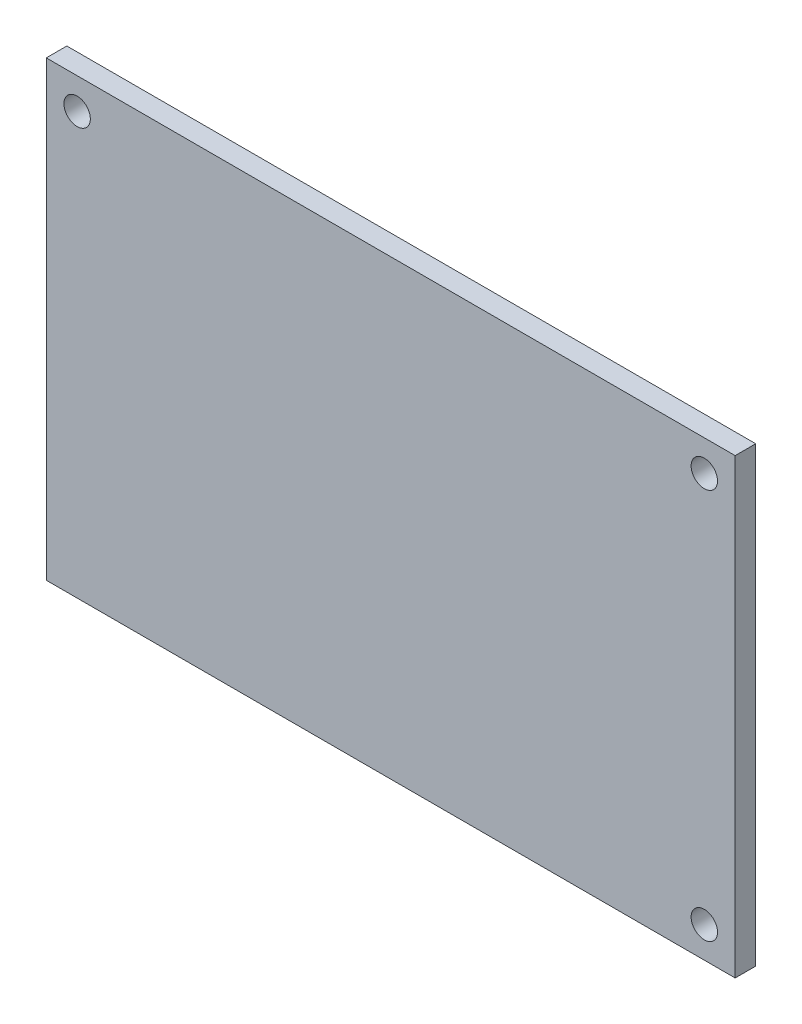
ISO-10303-21;
HEADER;
FILE_DESCRIPTION(('STEP AP214'),'2;1');
FILE_NAME('part.step','',(''),(''),'','','');
FILE_SCHEMA(('AUTOMOTIVE_DESIGN { 1 0 10303 214 1 1 1 1 }'));
ENDSEC;
DATA;
#1=APPLICATION_CONTEXT('core data for automotive mechanical design processes');
#2=APPLICATION_PROTOCOL_DEFINITION('international standard','automotive_design',2000,#1);
#3=PRODUCT_CONTEXT('',#1,'mechanical');
#4=PRODUCT('Part','Part','',(#3));
#5=PRODUCT_RELATED_PRODUCT_CATEGORY('part','',(#4));
#6=PRODUCT_DEFINITION_FORMATION('','',#4);
#7=PRODUCT_DEFINITION_CONTEXT('part definition',#1,'design');
#8=PRODUCT_DEFINITION('design','',#6,#7);
#9=PRODUCT_DEFINITION_SHAPE('','',#8);
#10=(LENGTH_UNIT() NAMED_UNIT(*) SI_UNIT(.MILLI.,.METRE.));
#11=(NAMED_UNIT(*) PLANE_ANGLE_UNIT() SI_UNIT($,.RADIAN.));
#12=(NAMED_UNIT(*) SI_UNIT($,.STERADIAN.) SOLID_ANGLE_UNIT());
#13=UNCERTAINTY_MEASURE_WITH_UNIT(LENGTH_MEASURE(1.E-05),#10,'distance_accuracy_value','');
#14=(GEOMETRIC_REPRESENTATION_CONTEXT(3) GLOBAL_UNCERTAINTY_ASSIGNED_CONTEXT((#13)) GLOBAL_UNIT_ASSIGNED_CONTEXT((#10,
#11,#12)) REPRESENTATION_CONTEXT('',''));
#15=CARTESIAN_POINT('',(0.,0.,0.));
#16=DIRECTION('',(0.,0.,1.));
#17=DIRECTION('',(1.,0.,0.));
#18=AXIS2_PLACEMENT_3D('',#15,#16,#17);
#19=CARTESIAN_POINT('',(42.545,27.94,2.54));
#20=DIRECTION('',(-1.,0.,0.));
#21=DIRECTION('',(0.,0.,1.));
#22=AXIS2_PLACEMENT_3D('',#19,#20,#21);
#23=PLANE('',#22);
#24=DIRECTION('',(0.,1.,0.));
#25=VECTOR('',#24,1.);
#26=CARTESIAN_POINT('',(42.545,27.94,0.));
#27=LINE('',#26,#25);
#28=CARTESIAN_POINT('',(42.545,-27.94,0.));
#29=VERTEX_POINT('',#28);
#30=CARTESIAN_POINT('',(42.545,27.94,0.));
#31=VERTEX_POINT('',#30);
#32=EDGE_CURVE('E96',#29,#31,#27,.T.);
#33=ORIENTED_EDGE('',*,*,#32,.T.);
#34=DIRECTION('',(0.,0.,-1.));
#35=VECTOR('',#34,1.);
#36=CARTESIAN_POINT('',(42.545,27.94,2.54));
#37=LINE('',#36,#35);
#38=CARTESIAN_POINT('',(42.545,27.94,2.54));
#39=VERTEX_POINT('',#38);
#40=EDGE_CURVE('E11',#39,#31,#37,.T.);
#41=ORIENTED_EDGE('',*,*,#40,.F.);
#42=DIRECTION('',(0.,1.,0.));
#43=VECTOR('',#42,1.);
#44=CARTESIAN_POINT('',(42.545,27.94,2.54));
#45=LINE('',#44,#43);
#46=CARTESIAN_POINT('',(42.545,-27.94,2.54));
#47=VERTEX_POINT('',#46);
#48=EDGE_CURVE('E84',#47,#39,#45,.T.);
#49=ORIENTED_EDGE('',*,*,#48,.F.);
#50=DIRECTION('',(0.,0.,-1.));
#51=VECTOR('',#50,1.);
#52=CARTESIAN_POINT('',(42.545,-27.94,2.54));
#53=LINE('',#52,#51);
#54=EDGE_CURVE('E92',#47,#29,#53,.T.);
#55=ORIENTED_EDGE('',*,*,#54,.T.);
#56=EDGE_LOOP('',(#33,#41,#49,#55));
#57=FACE_BOUND('',#56,.T.);
#58=ADVANCED_FACE('F33',(#57),#23,.F.);
#59=CARTESIAN_POINT('',(-42.545,27.94,2.54));
#60=DIRECTION('',(0.,-1.,0.));
#61=DIRECTION('',(0.,0.,-1.));
#62=AXIS2_PLACEMENT_3D('',#59,#60,#61);
#63=PLANE('',#62);
#64=DIRECTION('',(-1.,0.,0.));
#65=VECTOR('',#64,1.);
#66=CARTESIAN_POINT('',(-42.545,27.94,0.));
#67=LINE('',#66,#65);
#68=CARTESIAN_POINT('',(-42.545,27.94,0.));
#69=VERTEX_POINT('',#68);
#70=EDGE_CURVE('E88',#31,#69,#67,.T.);
#71=ORIENTED_EDGE('',*,*,#70,.T.);
#72=DIRECTION('',(0.,0.,-1.));
#73=VECTOR('',#72,1.);
#74=CARTESIAN_POINT('',(-42.545,27.94,2.54));
#75=LINE('',#74,#73);
#76=CARTESIAN_POINT('',(-42.545,27.94,2.54));
#77=VERTEX_POINT('',#76);
#78=EDGE_CURVE('E41',#77,#69,#75,.T.);
#79=ORIENTED_EDGE('',*,*,#78,.F.);
#80=DIRECTION('',(-1.,0.,0.));
#81=VECTOR('',#80,1.);
#82=CARTESIAN_POINT('',(-42.545,27.94,2.54));
#83=LINE('',#82,#81);
#84=EDGE_CURVE('E79',#39,#77,#83,.T.);
#85=ORIENTED_EDGE('',*,*,#84,.F.);
#86=ORIENTED_EDGE('',*,*,#40,.T.);
#87=EDGE_LOOP('',(#71,#79,#85,#86));
#88=FACE_BOUND('',#87,.T.);
#89=ADVANCED_FACE('F87',(#88),#63,.F.);
#90=CARTESIAN_POINT('',(-42.545,27.94,2.54));
#91=DIRECTION('',(1.,0.,0.));
#92=DIRECTION('',(0.,1.,0.));
#93=AXIS2_PLACEMENT_3D('',#90,#91,#92);
#94=PLANE('',#93);
#95=DIRECTION('',(0.,-1.,0.));
#96=VECTOR('',#95,1.);
#97=CARTESIAN_POINT('',(-42.545,27.94,0.));
#98=LINE('',#97,#96);
#99=CARTESIAN_POINT('',(-42.545,-27.94,0.));
#100=VERTEX_POINT('',#99);
#101=EDGE_CURVE('E66',#69,#100,#98,.T.);
#102=ORIENTED_EDGE('',*,*,#101,.T.);
#103=DIRECTION('',(0.,0.,-1.));
#104=VECTOR('',#103,1.);
#105=CARTESIAN_POINT('',(-42.545,-27.94,2.54));
#106=LINE('',#105,#104);
#107=CARTESIAN_POINT('',(-42.545,-27.94,2.54));
#108=VERTEX_POINT('',#107);
#109=EDGE_CURVE('E89',#108,#100,#106,.T.);
#110=ORIENTED_EDGE('',*,*,#109,.F.);
#111=DIRECTION('',(0.,-1.,0.));
#112=VECTOR('',#111,1.);
#113=CARTESIAN_POINT('',(-42.545,27.94,2.54));
#114=LINE('',#113,#112);
#115=EDGE_CURVE('E82',#77,#108,#114,.T.);
#116=ORIENTED_EDGE('',*,*,#115,.F.);
#117=ORIENTED_EDGE('',*,*,#78,.T.);
#118=EDGE_LOOP('',(#102,#110,#116,#117));
#119=FACE_BOUND('',#118,.T.);
#120=ADVANCED_FACE('F90',(#119),#94,.F.);
#121=CARTESIAN_POINT('',(-42.545,-27.94,2.54));
#122=DIRECTION('',(0.,1.,0.));
#123=DIRECTION('',(0.,0.,1.));
#124=AXIS2_PLACEMENT_3D('',#121,#122,#123);
#125=PLANE('',#124);
#126=DIRECTION('',(1.,0.,0.));
#127=VECTOR('',#126,1.);
#128=CARTESIAN_POINT('',(-42.545,-27.94,0.));
#129=LINE('',#128,#127);
#130=EDGE_CURVE('E72',#100,#29,#129,.T.);
#131=ORIENTED_EDGE('',*,*,#130,.T.);
#132=ORIENTED_EDGE('',*,*,#54,.F.);
#133=DIRECTION('',(1.,0.,0.));
#134=VECTOR('',#133,1.);
#135=CARTESIAN_POINT('',(-42.545,-27.94,2.54));
#136=LINE('',#135,#134);
#137=EDGE_CURVE('E49',#108,#47,#136,.T.);
#138=ORIENTED_EDGE('',*,*,#137,.F.);
#139=ORIENTED_EDGE('',*,*,#109,.T.);
#140=EDGE_LOOP('',(#131,#132,#138,#139));
#141=FACE_BOUND('',#140,.T.);
#142=ADVANCED_FACE('F104',(#141),#125,.F.);
#143=CARTESIAN_POINT('',(0.,0.,2.54));
#144=DIRECTION('',(0.,0.,1.));
#145=DIRECTION('',(1.,0.,0.));
#146=AXIS2_PLACEMENT_3D('',#143,#144,#145);
#147=PLANE('',#146);
#148=CARTESIAN_POINT('',(-38.735,24.13,2.54));
#149=DIRECTION('',(0.,0.,1.));
#150=DIRECTION('',(1.,0.,0.));
#151=AXIS2_PLACEMENT_3D('',#148,#149,#150);
#152=CIRCLE('',#151,1.63195);
#153=CARTESIAN_POINT('',(-37.10305,24.13,2.54));
#154=VERTEX_POINT('',#153);
#155=EDGE_CURVE('E124',#154,#154,#152,.T.);
#156=ORIENTED_EDGE('',*,*,#155,.F.);
#157=EDGE_LOOP('',(#156));
#158=FACE_BOUND('',#157,.T.);
#159=CARTESIAN_POINT('',(38.735,-24.13,2.54));
#160=DIRECTION('',(0.,0.,1.));
#161=DIRECTION('',(1.,0.,0.));
#162=AXIS2_PLACEMENT_3D('',#159,#160,#161);
#163=CIRCLE('',#162,1.63195);
#164=CARTESIAN_POINT('',(40.36695,-24.13,2.54));
#165=VERTEX_POINT('',#164);
#166=EDGE_CURVE('E118',#165,#165,#163,.T.);
#167=ORIENTED_EDGE('',*,*,#166,.F.);
#168=EDGE_LOOP('',(#167));
#169=FACE_BOUND('',#168,.T.);
#170=CARTESIAN_POINT('',(38.735,24.13,2.54));
#171=DIRECTION('',(0.,0.,1.));
#172=DIRECTION('',(1.,0.,0.));
#173=AXIS2_PLACEMENT_3D('',#170,#171,#172);
#174=CIRCLE('',#173,1.63195);
#175=CARTESIAN_POINT('',(40.36695,24.13,2.54));
#176=VERTEX_POINT('',#175);
#177=EDGE_CURVE('E112',#176,#176,#174,.T.);
#178=ORIENTED_EDGE('',*,*,#177,.F.);
#179=EDGE_LOOP('',(#178));
#180=FACE_BOUND('',#179,.T.);
#181=ORIENTED_EDGE('',*,*,#48,.T.);
#182=ORIENTED_EDGE('',*,*,#84,.T.);
#183=ORIENTED_EDGE('',*,*,#115,.T.);
#184=ORIENTED_EDGE('',*,*,#137,.T.);
#185=EDGE_LOOP('',(#181,#182,#183,#184));
#186=FACE_BOUND('',#185,.T.);
#187=ADVANCED_FACE('F80',(#158,#169,#180,#186),#147,.T.);
#188=CARTESIAN_POINT('',(0.,0.,0.));
#189=DIRECTION('',(0.,0.,1.));
#190=DIRECTION('',(1.,0.,0.));
#191=AXIS2_PLACEMENT_3D('',#188,#189,#190);
#192=PLANE('',#191);
#193=CARTESIAN_POINT('',(-38.735,24.13,0.));
#194=DIRECTION('',(0.,0.,1.));
#195=DIRECTION('',(1.,0.,0.));
#196=AXIS2_PLACEMENT_3D('',#193,#194,#195);
#197=CIRCLE('',#196,1.63195);
#198=CARTESIAN_POINT('',(-37.10305,24.13,0.));
#199=VERTEX_POINT('',#198);
#200=EDGE_CURVE('E121',#199,#199,#197,.T.);
#201=ORIENTED_EDGE('',*,*,#200,.T.);
#202=EDGE_LOOP('',(#201));
#203=FACE_BOUND('',#202,.T.);
#204=CARTESIAN_POINT('',(38.735,-24.13,0.));
#205=DIRECTION('',(0.,0.,1.));
#206=DIRECTION('',(1.,0.,0.));
#207=AXIS2_PLACEMENT_3D('',#204,#205,#206);
#208=CIRCLE('',#207,1.63195);
#209=CARTESIAN_POINT('',(40.36695,-24.13,0.));
#210=VERTEX_POINT('',#209);
#211=EDGE_CURVE('E115',#210,#210,#208,.T.);
#212=ORIENTED_EDGE('',*,*,#211,.T.);
#213=EDGE_LOOP('',(#212));
#214=FACE_BOUND('',#213,.T.);
#215=CARTESIAN_POINT('',(38.735,24.13,0.));
#216=DIRECTION('',(0.,0.,1.));
#217=DIRECTION('',(1.,0.,0.));
#218=AXIS2_PLACEMENT_3D('',#215,#216,#217);
#219=CIRCLE('',#218,1.63195);
#220=CARTESIAN_POINT('',(40.36695,24.13,0.));
#221=VERTEX_POINT('',#220);
#222=EDGE_CURVE('E99',#221,#221,#219,.T.);
#223=ORIENTED_EDGE('',*,*,#222,.T.);
#224=EDGE_LOOP('',(#223));
#225=FACE_BOUND('',#224,.T.);
#226=ORIENTED_EDGE('',*,*,#32,.F.);
#227=ORIENTED_EDGE('',*,*,#130,.F.);
#228=ORIENTED_EDGE('',*,*,#101,.F.);
#229=ORIENTED_EDGE('',*,*,#70,.F.);
#230=EDGE_LOOP('',(#226,#227,#228,#229));
#231=FACE_BOUND('',#230,.T.);
#232=ADVANCED_FACE('F107',(#203,#214,#225,#231),#192,.F.);
#233=CARTESIAN_POINT('',(38.735,24.13,2.54));
#234=DIRECTION('',(0.,0.,1.));
#235=DIRECTION('',(1.,0.,0.));
#236=AXIS2_PLACEMENT_3D('',#233,#234,#235);
#237=CYLINDRICAL_SURFACE('',#236,1.63195);
#238=ORIENTED_EDGE('',*,*,#177,.T.);
#239=EDGE_LOOP('',(#238));
#240=FACE_BOUND('',#239,.T.);
#241=ORIENTED_EDGE('',*,*,#222,.F.);
#242=EDGE_LOOP('',(#241));
#243=FACE_BOUND('',#242,.T.);
#244=ADVANCED_FACE('F138',(#240,#243),#237,.F.);
#245=CARTESIAN_POINT('',(38.735,-24.13,2.54));
#246=DIRECTION('',(0.,0.,1.));
#247=DIRECTION('',(1.,0.,0.));
#248=AXIS2_PLACEMENT_3D('',#245,#246,#247);
#249=CYLINDRICAL_SURFACE('',#248,1.63195);
#250=ORIENTED_EDGE('',*,*,#166,.T.);
#251=EDGE_LOOP('',(#250));
#252=FACE_BOUND('',#251,.T.);
#253=ORIENTED_EDGE('',*,*,#211,.F.);
#254=EDGE_LOOP('',(#253));
#255=FACE_BOUND('',#254,.T.);
#256=ADVANCED_FACE('F141',(#252,#255),#249,.F.);
#257=CARTESIAN_POINT('',(-38.735,24.13,2.54));
#258=DIRECTION('',(0.,0.,1.));
#259=DIRECTION('',(1.,0.,0.));
#260=AXIS2_PLACEMENT_3D('',#257,#258,#259);
#261=CYLINDRICAL_SURFACE('',#260,1.63195);
#262=ORIENTED_EDGE('',*,*,#155,.T.);
#263=EDGE_LOOP('',(#262));
#264=FACE_BOUND('',#263,.T.);
#265=ORIENTED_EDGE('',*,*,#200,.F.);
#266=EDGE_LOOP('',(#265));
#267=FACE_BOUND('',#266,.T.);
#268=ADVANCED_FACE('F128',(#264,#267),#261,.F.);
#269=CLOSED_SHELL('',(#58,#89,#120,#142,#187,#232,#244,#256,#268));
#270=MANIFOLD_SOLID_BREP('B2',#269);
#271=ADVANCED_BREP_SHAPE_REPRESENTATION('',(#18,#270),#14);
#272=SHAPE_DEFINITION_REPRESENTATION(#9,#271);
ENDSEC;
END-ISO-10303-21;
